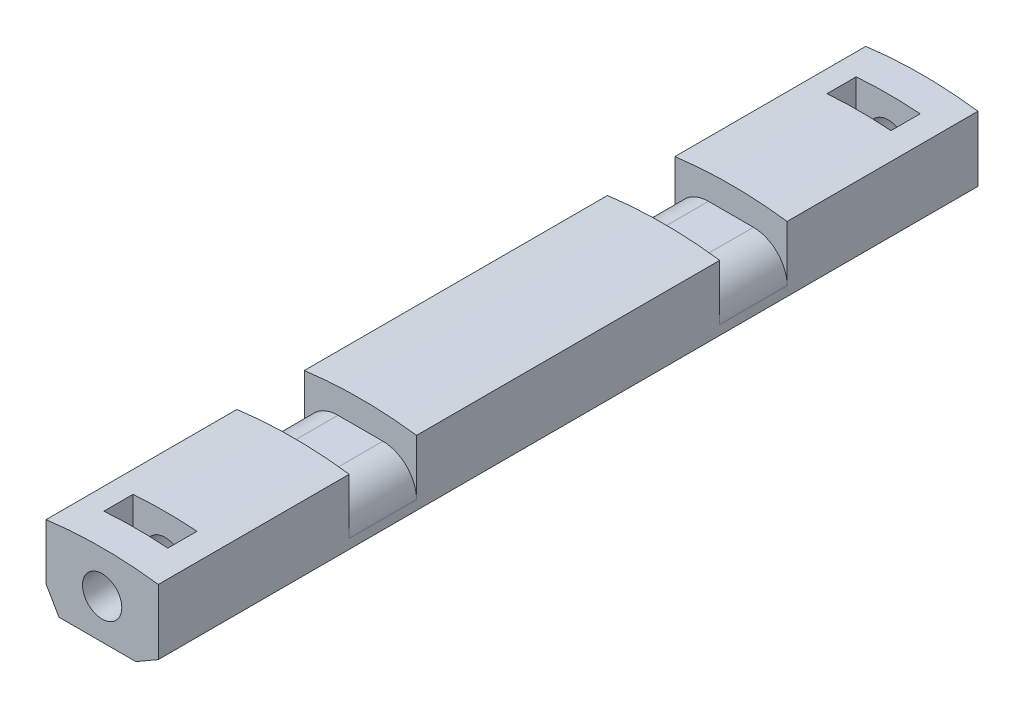
ISO-10303-21;
HEADER;
FILE_DESCRIPTION(('STEP AP214'),'2;1');
FILE_NAME('part.step','',(''),(''),'','','');
FILE_SCHEMA(('AUTOMOTIVE_DESIGN { 1 0 10303 214 1 1 1 1 }'));
ENDSEC;
DATA;
#1=APPLICATION_CONTEXT('core data for automotive mechanical design processes');
#2=APPLICATION_PROTOCOL_DEFINITION('international standard','automotive_design',2000,#1);
#3=PRODUCT_CONTEXT('',#1,'mechanical');
#4=PRODUCT('Part','Part','',(#3));
#5=PRODUCT_RELATED_PRODUCT_CATEGORY('part','',(#4));
#6=PRODUCT_DEFINITION_FORMATION('','',#4);
#7=PRODUCT_DEFINITION_CONTEXT('part definition',#1,'design');
#8=PRODUCT_DEFINITION('design','',#6,#7);
#9=PRODUCT_DEFINITION_SHAPE('','',#8);
#10=(LENGTH_UNIT() NAMED_UNIT(*) SI_UNIT(.MILLI.,.METRE.));
#11=(NAMED_UNIT(*) PLANE_ANGLE_UNIT() SI_UNIT($,.RADIAN.));
#12=(NAMED_UNIT(*) SI_UNIT($,.STERADIAN.) SOLID_ANGLE_UNIT());
#13=UNCERTAINTY_MEASURE_WITH_UNIT(LENGTH_MEASURE(1.E-05),#10,'distance_accuracy_value','');
#14=(GEOMETRIC_REPRESENTATION_CONTEXT(3) GLOBAL_UNCERTAINTY_ASSIGNED_CONTEXT((#13)) GLOBAL_UNIT_ASSIGNED_CONTEXT((#10,
#11,#12)) REPRESENTATION_CONTEXT('',''));
#15=CARTESIAN_POINT('',(0.,0.,0.));
#16=DIRECTION('',(0.,0.,1.));
#17=DIRECTION('',(1.,0.,0.));
#18=AXIS2_PLACEMENT_3D('',#15,#16,#17);
#19=CARTESIAN_POINT('',(-5.,0.,73.));
#20=DIRECTION('',(-1.,0.,0.));
#21=DIRECTION('',(0.,0.,1.));
#22=AXIS2_PLACEMENT_3D('',#19,#20,#21);
#23=PLANE('',#22);
#24=DIRECTION('',(0.,1.,0.));
#25=VECTOR('',#24,1.);
#26=CARTESIAN_POINT('',(-5.,0.,0.));
#27=LINE('',#26,#25);
#28=CARTESIAN_POINT('',(-5.,32.2140799131796,0.));
#29=VERTEX_POINT('',#28);
#30=CARTESIAN_POINT('',(-5.,37.1651718682963,0.));
#31=VERTEX_POINT('',#30);
#32=EDGE_CURVE('E371',#29,#31,#27,.T.);
#33=ORIENTED_EDGE('',*,*,#32,.F.);
#34=DIRECTION('',(0.,0.,1.));
#35=VECTOR('',#34,1.);
#36=CARTESIAN_POINT('',(-5.,32.2140799131796,73.));
#37=LINE('',#36,#35);
#38=CARTESIAN_POINT('',(-5.,32.2140799131795,17.));
#39=VERTEX_POINT('',#38);
#40=EDGE_CURVE('E11',#29,#39,#37,.T.);
#41=ORIENTED_EDGE('',*,*,#40,.T.);
#42=DIRECTION('',(0.,-1.,0.));
#43=VECTOR('',#42,1.);
#44=CARTESIAN_POINT('',(-5.,35.2140799131795,17.));
#45=LINE('',#44,#43);
#46=CARTESIAN_POINT('',(-5.,37.1651718682963,17.));
#47=VERTEX_POINT('',#46);
#48=EDGE_CURVE('E327',#47,#39,#45,.T.);
#49=ORIENTED_EDGE('',*,*,#48,.F.);
#50=DIRECTION('',(0.,0.,-1.));
#51=VECTOR('',#50,1.);
#52=CARTESIAN_POINT('',(-5.,37.1651718682963,73.));
#53=LINE('',#52,#51);
#54=EDGE_CURVE('E379',#47,#31,#53,.T.);
#55=ORIENTED_EDGE('',*,*,#54,.T.);
#56=EDGE_LOOP('',(#33,#41,#49,#55));
#57=FACE_BOUND('',#56,.T.);
#58=ADVANCED_FACE('F43',(#57),#23,.T.);
#59=DIRECTION('',(0.,1.,0.));
#60=VECTOR('',#59,1.);
#61=CARTESIAN_POINT('',(-5.,35.2140799131795,23.));
#62=LINE('',#61,#60);
#63=CARTESIAN_POINT('',(-5.,32.2140799131795,23.));
#64=VERTEX_POINT('',#63);
#65=CARTESIAN_POINT('',(-5.,37.1651718682963,23.));
#66=VERTEX_POINT('',#65);
#67=EDGE_CURVE('E326',#64,#66,#62,.T.);
#68=ORIENTED_EDGE('',*,*,#67,.F.);
#69=DIRECTION('',(0.,0.,1.));
#70=VECTOR('',#69,1.);
#71=CARTESIAN_POINT('',(-5.,32.2140799131796,73.));
#72=LINE('',#71,#70);
#73=CARTESIAN_POINT('',(-5.,32.2140799131795,50.));
#74=VERTEX_POINT('',#73);
#75=EDGE_CURVE('E52',#64,#74,#72,.T.);
#76=ORIENTED_EDGE('',*,*,#75,.T.);
#77=DIRECTION('',(0.,-1.,0.));
#78=VECTOR('',#77,1.);
#79=CARTESIAN_POINT('',(-5.,35.2140799131795,50.));
#80=LINE('',#79,#78);
#81=CARTESIAN_POINT('',(-5.,37.1651718682963,50.));
#82=VERTEX_POINT('',#81);
#83=EDGE_CURVE('E330',#82,#74,#80,.T.);
#84=ORIENTED_EDGE('',*,*,#83,.F.);
#85=EDGE_CURVE('E385',#82,#66,#53,.T.);
#86=ORIENTED_EDGE('',*,*,#85,.T.);
#87=EDGE_LOOP('',(#68,#76,#84,#86));
#88=FACE_BOUND('',#87,.T.);
#89=ADVANCED_FACE('F459',(#88),#23,.T.);
#90=CARTESIAN_POINT('',(0.,0.,73.));
#91=DIRECTION('',(0.,0.,-1.));
#92=DIRECTION('',(-1.,0.,0.));
#93=AXIS2_PLACEMENT_3D('',#90,#91,#92);
#94=CYLINDRICAL_SURFACE('',#93,37.5);
#95=CARTESIAN_POINT('',(0.,0.,56.));
#96=DIRECTION('',(0.,0.,1.));
#97=DIRECTION('',(1.,0.,0.));
#98=AXIS2_PLACEMENT_3D('',#95,#96,#97);
#99=CIRCLE('',#98,37.5);
#100=CARTESIAN_POINT('',(-5.,37.1651718682963,56.));
#101=VERTEX_POINT('',#100);
#102=CARTESIAN_POINT('',(5.,37.1651718682963,56.));
#103=VERTEX_POINT('',#102);
#104=EDGE_CURVE('E335',#101,#103,#99,.F.);
#105=ORIENTED_EDGE('',*,*,#104,.F.);
#106=CARTESIAN_POINT('',(-5.,37.1651718682963,73.));
#107=VERTEX_POINT('',#106);
#108=EDGE_CURVE('E381',#107,#101,#53,.T.);
#109=ORIENTED_EDGE('',*,*,#108,.F.);
#110=CARTESIAN_POINT('',(0.,0.,73.));
#111=DIRECTION('',(0.,0.,1.));
#112=DIRECTION('',(1.,0.,0.));
#113=AXIS2_PLACEMENT_3D('',#110,#111,#112);
#114=CIRCLE('',#113,37.5);
#115=CARTESIAN_POINT('',(5.,37.1651718682963,73.));
#116=VERTEX_POINT('',#115);
#117=EDGE_CURVE('E358',#107,#116,#114,.F.);
#118=ORIENTED_EDGE('',*,*,#117,.T.);
#119=DIRECTION('',(0.,0.,-1.));
#120=VECTOR('',#119,1.);
#121=CARTESIAN_POINT('',(5.,37.1651718682963,73.));
#122=LINE('',#121,#120);
#123=EDGE_CURVE('E376',#116,#103,#122,.T.);
#124=ORIENTED_EDGE('',*,*,#123,.T.);
#125=EDGE_LOOP('',(#105,#109,#118,#124));
#126=FACE_BOUND('',#125,.T.);
#127=DIRECTION('',(0.,0.,1.));
#128=VECTOR('',#127,1.);
#129=CARTESIAN_POINT('',(-2.85,37.3915431615225,67.4));
#130=LINE('',#129,#128);
#131=CARTESIAN_POINT('',(-2.85,37.3915431615225,67.4));
#132=VERTEX_POINT('',#131);
#133=CARTESIAN_POINT('',(-2.85,37.3915431615225,70.));
#134=VERTEX_POINT('',#133);
#135=EDGE_CURVE('E235',#132,#134,#130,.T.);
#136=ORIENTED_EDGE('',*,*,#135,.F.);
#137=CARTESIAN_POINT('',(0.,0.,67.4));
#138=DIRECTION('',(0.,0.,1.));
#139=DIRECTION('',(1.,0.,0.));
#140=AXIS2_PLACEMENT_3D('',#137,#138,#139);
#141=CIRCLE('',#140,37.5);
#142=CARTESIAN_POINT('',(2.85,37.3915431615225,67.4));
#143=VERTEX_POINT('',#142);
#144=EDGE_CURVE('E242',#143,#132,#141,.T.);
#145=ORIENTED_EDGE('',*,*,#144,.F.);
#146=DIRECTION('',(0.,0.,1.));
#147=VECTOR('',#146,1.);
#148=CARTESIAN_POINT('',(2.85,37.3915431615225,67.4));
#149=LINE('',#148,#147);
#150=CARTESIAN_POINT('',(2.85,37.3915431615225,70.));
#151=VERTEX_POINT('',#150);
#152=EDGE_CURVE('E439',#143,#151,#149,.T.);
#153=ORIENTED_EDGE('',*,*,#152,.T.);
#154=CARTESIAN_POINT('',(0.,0.,70.));
#155=DIRECTION('',(0.,0.,1.));
#156=DIRECTION('',(1.,0.,0.));
#157=AXIS2_PLACEMENT_3D('',#154,#155,#156);
#158=CIRCLE('',#157,37.5);
#159=EDGE_CURVE('E256',#151,#134,#158,.T.);
#160=ORIENTED_EDGE('',*,*,#159,.T.);
#161=EDGE_LOOP('',(#136,#145,#153,#160));
#162=FACE_BOUND('',#161,.T.);
#163=ADVANCED_FACE('F255',(#126,#162),#94,.T.);
#164=CARTESIAN_POINT('',(0.,0.,17.));
#165=DIRECTION('',(0.,0.,-1.));
#166=DIRECTION('',(-1.,0.,0.));
#167=AXIS2_PLACEMENT_3D('',#164,#165,#166);
#168=CIRCLE('',#167,37.5);
#169=CARTESIAN_POINT('',(5.,37.1651718682963,17.));
#170=VERTEX_POINT('',#169);
#171=EDGE_CURVE('E355',#170,#47,#168,.F.);
#172=ORIENTED_EDGE('',*,*,#171,.F.);
#173=CARTESIAN_POINT('',(5.,37.1651718682963,0.));
#174=VERTEX_POINT('',#173);
#175=EDGE_CURVE('E368',#170,#174,#122,.T.);
#176=ORIENTED_EDGE('',*,*,#175,.T.);
#177=CARTESIAN_POINT('',(0.,0.,0.));
#178=DIRECTION('',(0.,0.,1.));
#179=DIRECTION('',(1.,0.,0.));
#180=AXIS2_PLACEMENT_3D('',#177,#178,#179);
#181=CIRCLE('',#180,37.5);
#182=EDGE_CURVE('E357',#31,#174,#181,.F.);
#183=ORIENTED_EDGE('',*,*,#182,.F.);
#184=ORIENTED_EDGE('',*,*,#54,.F.);
#185=EDGE_LOOP('',(#172,#176,#183,#184));
#186=FACE_BOUND('',#185,.T.);
#187=DIRECTION('',(0.,0.,-1.));
#188=VECTOR('',#187,1.);
#189=CARTESIAN_POINT('',(2.85,37.3915431615225,5.6));
#190=LINE('',#189,#188);
#191=CARTESIAN_POINT('',(2.85,37.3915431615225,5.6));
#192=VERTEX_POINT('',#191);
#193=CARTESIAN_POINT('',(2.85,37.3915431615225,3.));
#194=VERTEX_POINT('',#193);
#195=EDGE_CURVE('E280',#192,#194,#190,.T.);
#196=ORIENTED_EDGE('',*,*,#195,.F.);
#197=CARTESIAN_POINT('',(0.,0.,5.6));
#198=DIRECTION('',(0.,0.,-1.));
#199=DIRECTION('',(-1.,0.,0.));
#200=AXIS2_PLACEMENT_3D('',#197,#198,#199);
#201=CIRCLE('',#200,37.5);
#202=CARTESIAN_POINT('',(-2.85,37.3915431615225,5.6));
#203=VERTEX_POINT('',#202);
#204=EDGE_CURVE('E264',#203,#192,#201,.T.);
#205=ORIENTED_EDGE('',*,*,#204,.F.);
#206=DIRECTION('',(0.,0.,-1.));
#207=VECTOR('',#206,1.);
#208=CARTESIAN_POINT('',(-2.85,37.3915431615225,5.6));
#209=LINE('',#208,#207);
#210=CARTESIAN_POINT('',(-2.85,37.3915431615225,3.));
#211=VERTEX_POINT('',#210);
#212=EDGE_CURVE('E296',#203,#211,#209,.T.);
#213=ORIENTED_EDGE('',*,*,#212,.T.);
#214=CARTESIAN_POINT('',(0.,0.,3.));
#215=DIRECTION('',(0.,0.,-1.));
#216=DIRECTION('',(-1.,0.,0.));
#217=AXIS2_PLACEMENT_3D('',#214,#215,#216);
#218=CIRCLE('',#217,37.5);
#219=EDGE_CURVE('E281',#211,#194,#218,.T.);
#220=ORIENTED_EDGE('',*,*,#219,.T.);
#221=EDGE_LOOP('',(#196,#205,#213,#220));
#222=FACE_BOUND('',#221,.T.);
#223=ADVANCED_FACE('F521',(#186,#222),#94,.T.);
#224=CARTESIAN_POINT('',(0.,0.,23.));
#225=DIRECTION('',(0.,0.,1.));
#226=DIRECTION('',(1.,0.,0.));
#227=AXIS2_PLACEMENT_3D('',#224,#225,#226);
#228=CIRCLE('',#227,37.5);
#229=CARTESIAN_POINT('',(5.,37.1651718682963,23.));
#230=VERTEX_POINT('',#229);
#231=EDGE_CURVE('E353',#66,#230,#228,.F.);
#232=ORIENTED_EDGE('',*,*,#231,.F.);
#233=ORIENTED_EDGE('',*,*,#85,.F.);
#234=CARTESIAN_POINT('',(0.,0.,50.));
#235=DIRECTION('',(0.,0.,-1.));
#236=DIRECTION('',(-1.,0.,0.));
#237=AXIS2_PLACEMENT_3D('',#234,#235,#236);
#238=CIRCLE('',#237,37.5);
#239=CARTESIAN_POINT('',(5.,37.1651718682963,50.));
#240=VERTEX_POINT('',#239);
#241=EDGE_CURVE('E351',#240,#82,#238,.F.);
#242=ORIENTED_EDGE('',*,*,#241,.F.);
#243=EDGE_CURVE('E380',#240,#230,#122,.T.);
#244=ORIENTED_EDGE('',*,*,#243,.T.);
#245=EDGE_LOOP('',(#232,#233,#242,#244));
#246=FACE_BOUND('',#245,.T.);
#247=ADVANCED_FACE('F512',(#246),#94,.T.);
#248=DIRECTION('',(0.,1.,0.));
#249=VECTOR('',#248,1.);
#250=CARTESIAN_POINT('',(-5.,35.2140799131795,56.));
#251=LINE('',#250,#249);
#252=CARTESIAN_POINT('',(-5.,32.2140799131795,56.));
#253=VERTEX_POINT('',#252);
#254=EDGE_CURVE('E344',#253,#101,#251,.T.);
#255=ORIENTED_EDGE('',*,*,#254,.F.);
#256=DIRECTION('',(0.,0.,1.));
#257=VECTOR('',#256,1.);
#258=CARTESIAN_POINT('',(-5.,32.2140799131796,73.));
#259=LINE('',#258,#257);
#260=CARTESIAN_POINT('',(-5.,32.2140799131796,73.));
#261=VERTEX_POINT('',#260);
#262=EDGE_CURVE('E59',#253,#261,#259,.T.);
#263=ORIENTED_EDGE('',*,*,#262,.T.);
#264=DIRECTION('',(0.,1.,0.));
#265=VECTOR('',#264,1.);
#266=CARTESIAN_POINT('',(-5.,0.,73.));
#267=LINE('',#266,#265);
#268=EDGE_CURVE('E361',#261,#107,#267,.T.);
#269=ORIENTED_EDGE('',*,*,#268,.T.);
#270=ORIENTED_EDGE('',*,*,#108,.T.);
#271=EDGE_LOOP('',(#255,#263,#269,#270));
#272=FACE_BOUND('',#271,.T.);
#273=ADVANCED_FACE('F496',(#272),#23,.T.);
#274=CARTESIAN_POINT('',(0.,30.2140799131795,73.));
#275=DIRECTION('',(0.,1.,0.));
#276=DIRECTION('',(0.,0.,1.));
#277=AXIS2_PLACEMENT_3D('',#274,#275,#276);
#278=PLANE('',#277);
#279=DIRECTION('',(1.,0.,0.));
#280=VECTOR('',#279,1.);
#281=CARTESIAN_POINT('',(0.,30.2140799131795,0.));
#282=LINE('',#281,#280);
#283=CARTESIAN_POINT('',(-3.84529946162075,30.2140799131795,0.));
#284=VERTEX_POINT('',#283);
#285=CARTESIAN_POINT('',(3.,30.2140799131795,0.));
#286=VERTEX_POINT('',#285);
#287=EDGE_CURVE('E373',#284,#286,#282,.T.);
#288=ORIENTED_EDGE('',*,*,#287,.T.);
#289=DIRECTION('',(0.,0.,1.));
#290=VECTOR('',#289,1.);
#291=CARTESIAN_POINT('',(3.,30.2140799131795,73.));
#292=LINE('',#291,#290);
#293=CARTESIAN_POINT('',(3.,30.2140799131795,73.));
#294=VERTEX_POINT('',#293);
#295=EDGE_CURVE('E67',#286,#294,#292,.T.);
#296=ORIENTED_EDGE('',*,*,#295,.T.);
#297=DIRECTION('',(1.,0.,0.));
#298=VECTOR('',#297,1.);
#299=CARTESIAN_POINT('',(0.,30.2140799131795,73.));
#300=LINE('',#299,#298);
#301=CARTESIAN_POINT('',(-3.84529946162075,30.2140799131795,73.));
#302=VERTEX_POINT('',#301);
#303=EDGE_CURVE('E364',#302,#294,#300,.T.);
#304=ORIENTED_EDGE('',*,*,#303,.F.);
#305=DIRECTION('',(0.,0.,-1.));
#306=VECTOR('',#305,1.);
#307=CARTESIAN_POINT('',(-3.84529946162075,30.2140799131795,0.));
#308=LINE('',#307,#306);
#309=EDGE_CURVE('E448',#302,#284,#308,.T.);
#310=ORIENTED_EDGE('',*,*,#309,.T.);
#311=EDGE_LOOP('',(#288,#296,#304,#310));
#312=FACE_BOUND('',#311,.T.);
#313=ADVANCED_FACE('F478',(#312),#278,.F.);
#314=CARTESIAN_POINT('',(5.,0.,73.));
#315=DIRECTION('',(-1.,0.,0.));
#316=DIRECTION('',(0.,0.,1.));
#317=AXIS2_PLACEMENT_3D('',#314,#315,#316);
#318=PLANE('',#317);
#319=DIRECTION('',(0.,1.,0.));
#320=VECTOR('',#319,1.);
#321=CARTESIAN_POINT('',(5.,0.,73.));
#322=LINE('',#321,#320);
#323=CARTESIAN_POINT('',(5.,31.3687804515588,73.));
#324=VERTEX_POINT('',#323);
#325=EDGE_CURVE('E366',#324,#116,#322,.T.);
#326=ORIENTED_EDGE('',*,*,#325,.F.);
#327=DIRECTION('',(0.,0.,-1.));
#328=VECTOR('',#327,1.);
#329=CARTESIAN_POINT('',(5.,31.3687804515588,73.));
#330=LINE('',#329,#328);
#331=CARTESIAN_POINT('',(5.,31.3687804515588,0.));
#332=VERTEX_POINT('',#331);
#333=EDGE_CURVE('E431',#324,#332,#330,.T.);
#334=ORIENTED_EDGE('',*,*,#333,.T.);
#335=DIRECTION('',(0.,1.,0.));
#336=VECTOR('',#335,1.);
#337=CARTESIAN_POINT('',(5.,0.,0.));
#338=LINE('',#337,#336);
#339=EDGE_CURVE('E362',#332,#174,#338,.T.);
#340=ORIENTED_EDGE('',*,*,#339,.T.);
#341=ORIENTED_EDGE('',*,*,#175,.F.);
#342=DIRECTION('',(0.,-1.,0.));
#343=VECTOR('',#342,1.);
#344=CARTESIAN_POINT('',(5.,0.,17.));
#345=LINE('',#344,#343);
#346=CARTESIAN_POINT('',(5.,32.2140799131795,17.));
#347=VERTEX_POINT('',#346);
#348=EDGE_CURVE('E387',#170,#347,#345,.T.);
#349=ORIENTED_EDGE('',*,*,#348,.T.);
#350=DIRECTION('',(0.,0.,1.));
#351=VECTOR('',#350,1.);
#352=CARTESIAN_POINT('',(5.,32.2140799131795,73.));
#353=LINE('',#352,#351);
#354=CARTESIAN_POINT('',(5.,32.2140799131795,23.));
#355=VERTEX_POINT('',#354);
#356=EDGE_CURVE('E389',#347,#355,#353,.T.);
#357=ORIENTED_EDGE('',*,*,#356,.T.);
#358=DIRECTION('',(0.,1.,0.));
#359=VECTOR('',#358,1.);
#360=CARTESIAN_POINT('',(5.,35.2140799131795,23.));
#361=LINE('',#360,#359);
#362=EDGE_CURVE('E322',#355,#230,#361,.T.);
#363=ORIENTED_EDGE('',*,*,#362,.T.);
#364=ORIENTED_EDGE('',*,*,#243,.F.);
#365=DIRECTION('',(0.,-1.,0.));
#366=VECTOR('',#365,1.);
#367=CARTESIAN_POINT('',(5.,0.,50.));
#368=LINE('',#367,#366);
#369=CARTESIAN_POINT('',(5.,32.2140799131795,50.));
#370=VERTEX_POINT('',#369);
#371=EDGE_CURVE('E384',#240,#370,#368,.T.);
#372=ORIENTED_EDGE('',*,*,#371,.T.);
#373=DIRECTION('',(0.,0.,1.));
#374=VECTOR('',#373,1.);
#375=CARTESIAN_POINT('',(5.,32.2140799131795,73.));
#376=LINE('',#375,#374);
#377=CARTESIAN_POINT('',(5.,32.2140799131795,56.));
#378=VERTEX_POINT('',#377);
#379=EDGE_CURVE('E392',#370,#378,#376,.T.);
#380=ORIENTED_EDGE('',*,*,#379,.T.);
#381=DIRECTION('',(0.,1.,0.));
#382=VECTOR('',#381,1.);
#383=CARTESIAN_POINT('',(5.,35.2140799131795,56.));
#384=LINE('',#383,#382);
#385=EDGE_CURVE('E341',#378,#103,#384,.T.);
#386=ORIENTED_EDGE('',*,*,#385,.T.);
#387=ORIENTED_EDGE('',*,*,#123,.F.);
#388=EDGE_LOOP('',(#326,#334,#340,#341,#349,#357,#363,#364,#372,#380,#386,#387));
#389=FACE_BOUND('',#388,.T.);
#390=ADVANCED_FACE('F489',(#389),#318,.F.);
#391=CARTESIAN_POINT('',(0.,0.,73.));
#392=DIRECTION('',(0.,0.,1.));
#393=DIRECTION('',(1.,0.,0.));
#394=AXIS2_PLACEMENT_3D('',#391,#392,#393);
#395=PLANE('',#394);
#396=CARTESIAN_POINT('',(0.,33.75,73.));
#397=DIRECTION('',(0.,0.,1.));
#398=DIRECTION('',(1.,0.,0.));
#399=AXIS2_PLACEMENT_3D('',#396,#397,#398);
#400=CIRCLE('',#399,1.75);
#401=CARTESIAN_POINT('',(1.75,33.75,73.));
#402=VERTEX_POINT('',#401);
#403=EDGE_CURVE('E311',#402,#402,#400,.T.);
#404=ORIENTED_EDGE('',*,*,#403,.F.);
#405=EDGE_LOOP('',(#404));
#406=FACE_BOUND('',#405,.T.);
#407=ORIENTED_EDGE('',*,*,#303,.T.);
#408=DIRECTION('',(-0.866025403784441,-0.499999999999997,0.));
#409=VECTOR('',#408,1.);
#410=CARTESIAN_POINT('',(-12.3330803783933,21.3615218292081,73.));
#411=LINE('',#410,#409);
#412=EDGE_CURVE('E454',#294,#324,#411,.F.);
#413=ORIENTED_EDGE('',*,*,#412,.T.);
#414=ORIENTED_EDGE('',*,*,#325,.T.);
#415=ORIENTED_EDGE('',*,*,#117,.F.);
#416=ORIENTED_EDGE('',*,*,#268,.F.);
#417=DIRECTION('',(0.499999999999997,-0.86602540378444,0.));
#418=VECTOR('',#417,1.);
#419=CARTESIAN_POINT('',(10.1991057821777,5.88845646883371,73.));
#420=LINE('',#419,#418);
#421=EDGE_CURVE('E452',#261,#302,#420,.T.);
#422=ORIENTED_EDGE('',*,*,#421,.T.);
#423=EDGE_LOOP('',(#407,#413,#414,#415,#416,#422));
#424=FACE_BOUND('',#423,.T.);
#425=ADVANCED_FACE('F475',(#406,#424),#395,.T.);
#426=CARTESIAN_POINT('',(0.,0.,0.));
#427=DIRECTION('',(0.,0.,1.));
#428=DIRECTION('',(1.,0.,0.));
#429=AXIS2_PLACEMENT_3D('',#426,#427,#428);
#430=PLANE('',#429);
#431=CARTESIAN_POINT('',(0.,33.75,0.));
#432=DIRECTION('',(0.,0.,-1.));
#433=DIRECTION('',(-1.,0.,0.));
#434=AXIS2_PLACEMENT_3D('',#431,#432,#433);
#435=CIRCLE('',#434,1.75);
#436=CARTESIAN_POINT('',(-1.75,33.75,0.));
#437=VERTEX_POINT('',#436);
#438=EDGE_CURVE('E312',#437,#437,#435,.T.);
#439=ORIENTED_EDGE('',*,*,#438,.F.);
#440=EDGE_LOOP('',(#439));
#441=FACE_BOUND('',#440,.T.);
#442=ORIENTED_EDGE('',*,*,#339,.F.);
#443=DIRECTION('',(0.866025403784441,0.499999999999997,0.));
#444=VECTOR('',#443,1.);
#445=CARTESIAN_POINT('',(5.,31.3687804515588,0.));
#446=LINE('',#445,#444);
#447=EDGE_CURVE('E446',#332,#286,#446,.F.);
#448=ORIENTED_EDGE('',*,*,#447,.T.);
#449=ORIENTED_EDGE('',*,*,#287,.F.);
#450=DIRECTION('',(-0.499999999999997,0.86602540378444,0.));
#451=VECTOR('',#450,1.);
#452=CARTESIAN_POINT('',(-3.84529946162075,30.2140799131795,0.));
#453=LINE('',#452,#451);
#454=EDGE_CURVE('E444',#284,#29,#453,.T.);
#455=ORIENTED_EDGE('',*,*,#454,.T.);
#456=ORIENTED_EDGE('',*,*,#32,.T.);
#457=ORIENTED_EDGE('',*,*,#182,.T.);
#458=EDGE_LOOP('',(#442,#448,#449,#455,#456,#457));
#459=FACE_BOUND('',#458,.T.);
#460=ADVANCED_FACE('F482',(#441,#459),#430,.F.);
#461=CARTESIAN_POINT('',(5.,35.2140799131795,50.));
#462=DIRECTION('',(0.,0.,-1.));
#463=DIRECTION('',(-1.,0.,0.));
#464=AXIS2_PLACEMENT_3D('',#461,#462,#463);
#465=PLANE('',#464);
#466=ORIENTED_EDGE('',*,*,#241,.T.);
#467=ORIENTED_EDGE('',*,*,#83,.T.);
#468=CARTESIAN_POINT('',(-2.,32.2140799131795,50.));
#469=DIRECTION('',(0.,0.,-1.));
#470=DIRECTION('',(-1.,0.,0.));
#471=AXIS2_PLACEMENT_3D('',#468,#469,#470);
#472=CIRCLE('',#471,3.);
#473=CARTESIAN_POINT('',(-2.,35.2140799131795,50.));
#474=VERTEX_POINT('',#473);
#475=EDGE_CURVE('E419',#74,#474,#472,.T.);
#476=ORIENTED_EDGE('',*,*,#475,.T.);
#477=DIRECTION('',(-1.,0.,0.));
#478=VECTOR('',#477,1.);
#479=CARTESIAN_POINT('',(5.,35.2140799131795,50.));
#480=LINE('',#479,#478);
#481=CARTESIAN_POINT('',(2.,35.2140799131795,50.));
#482=VERTEX_POINT('',#481);
#483=EDGE_CURVE('E338',#482,#474,#480,.T.);
#484=ORIENTED_EDGE('',*,*,#483,.F.);
#485=CARTESIAN_POINT('',(2.,32.2140799131795,50.));
#486=DIRECTION('',(0.,0.,-1.));
#487=DIRECTION('',(-1.,0.,0.));
#488=AXIS2_PLACEMENT_3D('',#485,#486,#487);
#489=CIRCLE('',#488,3.);
#490=EDGE_CURVE('E413',#482,#370,#489,.T.);
#491=ORIENTED_EDGE('',*,*,#490,.T.);
#492=ORIENTED_EDGE('',*,*,#371,.F.);
#493=EDGE_LOOP('',(#466,#467,#476,#484,#491,#492));
#494=FACE_BOUND('',#493,.T.);
#495=ADVANCED_FACE('F465',(#494),#465,.F.);
#496=CARTESIAN_POINT('',(5.,35.2140799131795,56.));
#497=DIRECTION('',(0.,0.,1.));
#498=DIRECTION('',(1.,0.,0.));
#499=AXIS2_PLACEMENT_3D('',#496,#497,#498);
#500=PLANE('',#499);
#501=ORIENTED_EDGE('',*,*,#104,.T.);
#502=ORIENTED_EDGE('',*,*,#385,.F.);
#503=CARTESIAN_POINT('',(2.,32.2140799131795,56.));
#504=DIRECTION('',(0.,0.,1.));
#505=DIRECTION('',(1.,0.,0.));
#506=AXIS2_PLACEMENT_3D('',#503,#504,#505);
#507=CIRCLE('',#506,3.);
#508=CARTESIAN_POINT('',(2.,35.2140799131795,56.));
#509=VERTEX_POINT('',#508);
#510=EDGE_CURVE('E411',#378,#509,#507,.T.);
#511=ORIENTED_EDGE('',*,*,#510,.T.);
#512=DIRECTION('',(-1.,0.,0.));
#513=VECTOR('',#512,1.);
#514=CARTESIAN_POINT('',(5.,35.2140799131795,56.));
#515=LINE('',#514,#513);
#516=CARTESIAN_POINT('',(-2.,35.2140799131795,56.));
#517=VERTEX_POINT('',#516);
#518=EDGE_CURVE('E319',#509,#517,#515,.T.);
#519=ORIENTED_EDGE('',*,*,#518,.T.);
#520=CARTESIAN_POINT('',(-2.,32.2140799131795,56.));
#521=DIRECTION('',(0.,0.,1.));
#522=DIRECTION('',(1.,0.,0.));
#523=AXIS2_PLACEMENT_3D('',#520,#521,#522);
#524=CIRCLE('',#523,3.);
#525=EDGE_CURVE('E416',#517,#253,#524,.T.);
#526=ORIENTED_EDGE('',*,*,#525,.T.);
#527=ORIENTED_EDGE('',*,*,#254,.T.);
#528=EDGE_LOOP('',(#501,#502,#511,#519,#526,#527));
#529=FACE_BOUND('',#528,.T.);
#530=ADVANCED_FACE('F498',(#529),#500,.F.);
#531=CARTESIAN_POINT('',(5.,35.2140799131795,50.));
#532=DIRECTION('',(0.,-1.,0.));
#533=DIRECTION('',(1.,0.,0.));
#534=AXIS2_PLACEMENT_3D('',#531,#532,#533);
#535=PLANE('',#534);
#536=ORIENTED_EDGE('',*,*,#518,.F.);
#537=DIRECTION('',(0.,0.,1.));
#538=VECTOR('',#537,1.);
#539=CARTESIAN_POINT('',(2.,35.2140799131795,50.));
#540=LINE('',#539,#538);
#541=EDGE_CURVE('E398',#509,#482,#540,.F.);
#542=ORIENTED_EDGE('',*,*,#541,.T.);
#543=ORIENTED_EDGE('',*,*,#483,.T.);
#544=DIRECTION('',(0.,0.,1.));
#545=VECTOR('',#544,1.);
#546=CARTESIAN_POINT('',(-2.,35.2140799131795,56.));
#547=LINE('',#546,#545);
#548=EDGE_CURVE('E395',#474,#517,#547,.T.);
#549=ORIENTED_EDGE('',*,*,#548,.T.);
#550=EDGE_LOOP('',(#536,#542,#543,#549));
#551=FACE_BOUND('',#550,.T.);
#552=ADVANCED_FACE('F501',(#551),#535,.F.);
#553=CARTESIAN_POINT('',(5.,35.2140799131795,17.));
#554=DIRECTION('',(0.,0.,-1.));
#555=DIRECTION('',(-1.,0.,0.));
#556=AXIS2_PLACEMENT_3D('',#553,#554,#555);
#557=PLANE('',#556);
#558=ORIENTED_EDGE('',*,*,#171,.T.);
#559=ORIENTED_EDGE('',*,*,#48,.T.);
#560=CARTESIAN_POINT('',(-2.,32.2140799131795,17.));
#561=DIRECTION('',(0.,0.,-1.));
#562=DIRECTION('',(-1.,0.,0.));
#563=AXIS2_PLACEMENT_3D('',#560,#561,#562);
#564=CIRCLE('',#563,3.);
#565=CARTESIAN_POINT('',(-2.,35.2140799131795,17.));
#566=VERTEX_POINT('',#565);
#567=EDGE_CURVE('E429',#39,#566,#564,.T.);
#568=ORIENTED_EDGE('',*,*,#567,.T.);
#569=DIRECTION('',(-1.,0.,0.));
#570=VECTOR('',#569,1.);
#571=CARTESIAN_POINT('',(5.,35.2140799131795,17.));
#572=LINE('',#571,#570);
#573=CARTESIAN_POINT('',(2.,35.2140799131795,17.));
#574=VERTEX_POINT('',#573);
#575=EDGE_CURVE('E325',#574,#566,#572,.T.);
#576=ORIENTED_EDGE('',*,*,#575,.F.);
#577=CARTESIAN_POINT('',(2.,32.2140799131795,17.));
#578=DIRECTION('',(0.,0.,-1.));
#579=DIRECTION('',(-1.,0.,0.));
#580=AXIS2_PLACEMENT_3D('',#577,#578,#579);
#581=CIRCLE('',#580,3.);
#582=EDGE_CURVE('E423',#574,#347,#581,.T.);
#583=ORIENTED_EDGE('',*,*,#582,.T.);
#584=ORIENTED_EDGE('',*,*,#348,.F.);
#585=EDGE_LOOP('',(#558,#559,#568,#576,#583,#584));
#586=FACE_BOUND('',#585,.T.);
#587=ADVANCED_FACE('F527',(#586),#557,.F.);
#588=CARTESIAN_POINT('',(5.,35.2140799131795,23.));
#589=DIRECTION('',(0.,0.,1.));
#590=DIRECTION('',(1.,0.,0.));
#591=AXIS2_PLACEMENT_3D('',#588,#589,#590);
#592=PLANE('',#591);
#593=ORIENTED_EDGE('',*,*,#231,.T.);
#594=ORIENTED_EDGE('',*,*,#362,.F.);
#595=CARTESIAN_POINT('',(2.,32.2140799131795,23.));
#596=DIRECTION('',(0.,0.,1.));
#597=DIRECTION('',(1.,0.,0.));
#598=AXIS2_PLACEMENT_3D('',#595,#596,#597);
#599=CIRCLE('',#598,3.);
#600=CARTESIAN_POINT('',(2.,35.2140799131795,23.));
#601=VERTEX_POINT('',#600);
#602=EDGE_CURVE('E421',#355,#601,#599,.T.);
#603=ORIENTED_EDGE('',*,*,#602,.T.);
#604=DIRECTION('',(-1.,0.,0.));
#605=VECTOR('',#604,1.);
#606=CARTESIAN_POINT('',(5.,35.2140799131795,23.));
#607=LINE('',#606,#605);
#608=CARTESIAN_POINT('',(-2.,35.2140799131795,23.));
#609=VERTEX_POINT('',#608);
#610=EDGE_CURVE('E332',#601,#609,#607,.T.);
#611=ORIENTED_EDGE('',*,*,#610,.T.);
#612=CARTESIAN_POINT('',(-2.,32.2140799131795,23.));
#613=DIRECTION('',(0.,0.,1.));
#614=DIRECTION('',(1.,0.,0.));
#615=AXIS2_PLACEMENT_3D('',#612,#613,#614);
#616=CIRCLE('',#615,3.);
#617=EDGE_CURVE('E426',#609,#64,#616,.T.);
#618=ORIENTED_EDGE('',*,*,#617,.T.);
#619=ORIENTED_EDGE('',*,*,#67,.T.);
#620=EDGE_LOOP('',(#593,#594,#603,#611,#618,#619));
#621=FACE_BOUND('',#620,.T.);
#622=ADVANCED_FACE('F534',(#621),#592,.F.);
#623=CARTESIAN_POINT('',(5.,35.2140799131795,17.));
#624=DIRECTION('',(0.,-1.,0.));
#625=DIRECTION('',(1.,0.,0.));
#626=AXIS2_PLACEMENT_3D('',#623,#624,#625);
#627=PLANE('',#626);
#628=ORIENTED_EDGE('',*,*,#610,.F.);
#629=DIRECTION('',(0.,0.,1.));
#630=VECTOR('',#629,1.);
#631=CARTESIAN_POINT('',(2.,35.2140799131795,17.));
#632=LINE('',#631,#630);
#633=EDGE_CURVE('E409',#601,#574,#632,.F.);
#634=ORIENTED_EDGE('',*,*,#633,.T.);
#635=ORIENTED_EDGE('',*,*,#575,.T.);
#636=DIRECTION('',(0.,0.,1.));
#637=VECTOR('',#636,1.);
#638=CARTESIAN_POINT('',(-2.,35.2140799131795,23.));
#639=LINE('',#638,#637);
#640=EDGE_CURVE('E406',#566,#609,#639,.T.);
#641=ORIENTED_EDGE('',*,*,#640,.T.);
#642=EDGE_LOOP('',(#628,#634,#635,#641));
#643=FACE_BOUND('',#642,.T.);
#644=ADVANCED_FACE('F536',(#643),#627,.F.);
#645=CARTESIAN_POINT('',(0.,33.75,61.));
#646=DIRECTION('',(0.,0.,1.));
#647=DIRECTION('',(1.,0.,0.));
#648=AXIS2_PLACEMENT_3D('',#645,#646,#647);
#649=CYLINDRICAL_SURFACE('',#648,1.75);
#650=CARTESIAN_POINT('',(0.,33.75,70.));
#651=DIRECTION('',(0.,0.,1.));
#652=DIRECTION('',(1.,0.,0.));
#653=AXIS2_PLACEMENT_3D('',#650,#651,#652);
#654=CIRCLE('',#653,1.75);
#655=CARTESIAN_POINT('',(1.75,33.75,70.));
#656=VERTEX_POINT('',#655);
#657=EDGE_CURVE('E436',#656,#656,#654,.F.);
#658=ORIENTED_EDGE('',*,*,#657,.T.);
#659=EDGE_LOOP('',(#658));
#660=FACE_BOUND('',#659,.T.);
#661=ORIENTED_EDGE('',*,*,#403,.T.);
#662=EDGE_LOOP('',(#661));
#663=FACE_BOUND('',#662,.T.);
#664=ADVANCED_FACE('F586',(#660,#663),#649,.F.);
#665=CARTESIAN_POINT('',(0.,33.75,12.));
#666=DIRECTION('',(0.,0.,-1.));
#667=DIRECTION('',(-1.,0.,0.));
#668=AXIS2_PLACEMENT_3D('',#665,#666,#667);
#669=CYLINDRICAL_SURFACE('',#668,1.75);
#670=CARTESIAN_POINT('',(0.,33.75,3.));
#671=DIRECTION('',(0.,0.,-1.));
#672=DIRECTION('',(-1.,0.,0.));
#673=AXIS2_PLACEMENT_3D('',#670,#671,#672);
#674=CIRCLE('',#673,1.75);
#675=CARTESIAN_POINT('',(-1.75,33.75,3.));
#676=VERTEX_POINT('',#675);
#677=EDGE_CURVE('E299',#676,#676,#674,.F.);
#678=ORIENTED_EDGE('',*,*,#677,.T.);
#679=EDGE_LOOP('',(#678));
#680=FACE_BOUND('',#679,.T.);
#681=ORIENTED_EDGE('',*,*,#438,.T.);
#682=EDGE_LOOP('',(#681));
#683=FACE_BOUND('',#682,.T.);
#684=ADVANCED_FACE('F590',(#680,#683),#669,.F.);
#685=CARTESIAN_POINT('',(2.,32.2140799131795,73.));
#686=DIRECTION('',(0.,0.,1.));
#687=DIRECTION('',(1.,0.,0.));
#688=AXIS2_PLACEMENT_3D('',#685,#686,#687);
#689=CYLINDRICAL_SURFACE('',#688,3.);
#690=ORIENTED_EDGE('',*,*,#490,.F.);
#691=ORIENTED_EDGE('',*,*,#541,.F.);
#692=ORIENTED_EDGE('',*,*,#510,.F.);
#693=ORIENTED_EDGE('',*,*,#379,.F.);
#694=EDGE_LOOP('',(#690,#691,#692,#693));
#695=FACE_BOUND('',#694,.T.);
#696=ADVANCED_FACE('F506',(#695),#689,.T.);
#697=CARTESIAN_POINT('',(-2.,32.2140799131795,50.));
#698=DIRECTION('',(0.,0.,-1.));
#699=DIRECTION('',(-1.,0.,0.));
#700=AXIS2_PLACEMENT_3D('',#697,#698,#699);
#701=CYLINDRICAL_SURFACE('',#700,3.);
#702=ORIENTED_EDGE('',*,*,#475,.F.);
#703=DIRECTION('',(0.,0.,1.));
#704=VECTOR('',#703,1.);
#705=CARTESIAN_POINT('',(-5.,32.2140799131795,50.));
#706=LINE('',#705,#704);
#707=EDGE_CURVE('E403',#253,#74,#706,.F.);
#708=ORIENTED_EDGE('',*,*,#707,.F.);
#709=ORIENTED_EDGE('',*,*,#525,.F.);
#710=ORIENTED_EDGE('',*,*,#548,.F.);
#711=EDGE_LOOP('',(#702,#708,#709,#710));
#712=FACE_BOUND('',#711,.T.);
#713=ADVANCED_FACE('F471',(#712),#701,.T.);
#714=CARTESIAN_POINT('',(2.,32.2140799131795,73.));
#715=DIRECTION('',(0.,0.,1.));
#716=DIRECTION('',(1.,0.,0.));
#717=AXIS2_PLACEMENT_3D('',#714,#715,#716);
#718=CYLINDRICAL_SURFACE('',#717,3.);
#719=ORIENTED_EDGE('',*,*,#582,.F.);
#720=ORIENTED_EDGE('',*,*,#633,.F.);
#721=ORIENTED_EDGE('',*,*,#602,.F.);
#722=ORIENTED_EDGE('',*,*,#356,.F.);
#723=EDGE_LOOP('',(#719,#720,#721,#722));
#724=FACE_BOUND('',#723,.T.);
#725=ADVANCED_FACE('F531',(#724),#718,.T.);
#726=CARTESIAN_POINT('',(-2.,32.2140799131795,17.));
#727=DIRECTION('',(0.,0.,-1.));
#728=DIRECTION('',(-1.,0.,0.));
#729=AXIS2_PLACEMENT_3D('',#726,#727,#728);
#730=CYLINDRICAL_SURFACE('',#729,3.);
#731=ORIENTED_EDGE('',*,*,#567,.F.);
#732=DIRECTION('',(0.,0.,1.));
#733=VECTOR('',#732,1.);
#734=CARTESIAN_POINT('',(-5.,32.2140799131795,17.));
#735=LINE('',#734,#733);
#736=EDGE_CURVE('E400',#64,#39,#735,.F.);
#737=ORIENTED_EDGE('',*,*,#736,.F.);
#738=ORIENTED_EDGE('',*,*,#617,.F.);
#739=ORIENTED_EDGE('',*,*,#640,.F.);
#740=EDGE_LOOP('',(#731,#737,#738,#739));
#741=FACE_BOUND('',#740,.T.);
#742=ADVANCED_FACE('F540',(#741),#730,.T.);
#743=CARTESIAN_POINT('',(0.,0.,5.6));
#744=DIRECTION('',(0.,0.,-1.));
#745=DIRECTION('',(-1.,0.,0.));
#746=AXIS2_PLACEMENT_3D('',#743,#744,#745);
#747=PLANE('',#746);
#748=ORIENTED_EDGE('',*,*,#204,.T.);
#749=DIRECTION('',(0.,-1.,0.));
#750=VECTOR('',#749,1.);
#751=CARTESIAN_POINT('',(2.85,37.3915431615225,5.6));
#752=LINE('',#751,#750);
#753=CARTESIAN_POINT('',(2.85,31.9954482671904,5.6));
#754=VERTEX_POINT('',#753);
#755=EDGE_CURVE('E267',#192,#754,#752,.T.);
#756=ORIENTED_EDGE('',*,*,#755,.T.);
#757=DIRECTION('',(-0.866025403784438,-0.500000000000001,0.));
#758=VECTOR('',#757,1.);
#759=CARTESIAN_POINT('',(2.85,31.9954482671904,5.6));
#760=LINE('',#759,#758);
#761=CARTESIAN_POINT('',(0.,30.35,5.6));
#762=VERTEX_POINT('',#761);
#763=EDGE_CURVE('E271',#754,#762,#760,.T.);
#764=ORIENTED_EDGE('',*,*,#763,.T.);
#765=DIRECTION('',(-0.866025403784438,0.500000000000001,0.));
#766=VECTOR('',#765,1.);
#767=CARTESIAN_POINT('',(0.,30.35,5.6));
#768=LINE('',#767,#766);
#769=CARTESIAN_POINT('',(-2.85,31.9954482671904,5.6));
#770=VERTEX_POINT('',#769);
#771=EDGE_CURVE('E274',#762,#770,#768,.T.);
#772=ORIENTED_EDGE('',*,*,#771,.T.);
#773=DIRECTION('',(0.,1.,0.));
#774=VECTOR('',#773,1.);
#775=CARTESIAN_POINT('',(-2.85,31.9954482671904,5.6));
#776=LINE('',#775,#774);
#777=EDGE_CURVE('E277',#770,#203,#776,.T.);
#778=ORIENTED_EDGE('',*,*,#777,.T.);
#779=EDGE_LOOP('',(#748,#756,#764,#772,#778));
#780=FACE_BOUND('',#779,.T.);
#781=CARTESIAN_POINT('',(0.,33.75,5.6));
#782=DIRECTION('',(0.,0.,-1.));
#783=DIRECTION('',(-1.,0.,0.));
#784=AXIS2_PLACEMENT_3D('',#781,#782,#783);
#785=CIRCLE('',#784,1.75);
#786=CARTESIAN_POINT('',(-1.75,33.75,5.6));
#787=VERTEX_POINT('',#786);
#788=EDGE_CURVE('E315',#787,#787,#785,.F.);
#789=ORIENTED_EDGE('',*,*,#788,.T.);
#790=EDGE_LOOP('',(#789));
#791=FACE_BOUND('',#790,.T.);
#792=ADVANCED_FACE('F543',(#780,#791),#747,.T.);
#793=CARTESIAN_POINT('',(0.,0.,3.));
#794=DIRECTION('',(0.,0.,-1.));
#795=DIRECTION('',(-1.,0.,0.));
#796=AXIS2_PLACEMENT_3D('',#793,#794,#795);
#797=PLANE('',#796);
#798=ORIENTED_EDGE('',*,*,#219,.F.);
#799=DIRECTION('',(0.,1.,0.));
#800=VECTOR('',#799,1.);
#801=CARTESIAN_POINT('',(-2.85,31.9954482671904,3.));
#802=LINE('',#801,#800);
#803=CARTESIAN_POINT('',(-2.85,31.9954482671904,3.));
#804=VERTEX_POINT('',#803);
#805=EDGE_CURVE('E268',#804,#211,#802,.T.);
#806=ORIENTED_EDGE('',*,*,#805,.F.);
#807=DIRECTION('',(-0.866025403784438,0.500000000000001,0.));
#808=VECTOR('',#807,1.);
#809=CARTESIAN_POINT('',(0.,30.35,3.));
#810=LINE('',#809,#808);
#811=CARTESIAN_POINT('',(0.,30.35,3.));
#812=VERTEX_POINT('',#811);
#813=EDGE_CURVE('E291',#812,#804,#810,.T.);
#814=ORIENTED_EDGE('',*,*,#813,.F.);
#815=DIRECTION('',(-0.866025403784438,-0.500000000000001,0.));
#816=VECTOR('',#815,1.);
#817=CARTESIAN_POINT('',(2.85,31.9954482671904,3.));
#818=LINE('',#817,#816);
#819=CARTESIAN_POINT('',(2.85,31.9954482671904,3.));
#820=VERTEX_POINT('',#819);
#821=EDGE_CURVE('E288',#820,#812,#818,.T.);
#822=ORIENTED_EDGE('',*,*,#821,.F.);
#823=DIRECTION('',(0.,-1.,0.));
#824=VECTOR('',#823,1.);
#825=CARTESIAN_POINT('',(2.85,37.3915431615225,3.));
#826=LINE('',#825,#824);
#827=EDGE_CURVE('E284',#194,#820,#826,.T.);
#828=ORIENTED_EDGE('',*,*,#827,.F.);
#829=EDGE_LOOP('',(#798,#806,#814,#822,#828));
#830=FACE_BOUND('',#829,.T.);
#831=ORIENTED_EDGE('',*,*,#677,.F.);
#832=EDGE_LOOP('',(#831));
#833=FACE_BOUND('',#832,.T.);
#834=ADVANCED_FACE('F550',(#830,#833),#797,.F.);
#835=CARTESIAN_POINT('',(-2.85,31.9954482671904,5.6));
#836=DIRECTION('',(-1.,0.,0.));
#837=DIRECTION('',(0.,0.,1.));
#838=AXIS2_PLACEMENT_3D('',#835,#836,#837);
#839=PLANE('',#838);
#840=ORIENTED_EDGE('',*,*,#805,.T.);
#841=ORIENTED_EDGE('',*,*,#212,.F.);
#842=ORIENTED_EDGE('',*,*,#777,.F.);
#843=DIRECTION('',(0.,0.,-1.));
#844=VECTOR('',#843,1.);
#845=CARTESIAN_POINT('',(-2.85,31.9954482671904,5.6));
#846=LINE('',#845,#844);
#847=EDGE_CURVE('E300',#770,#804,#846,.T.);
#848=ORIENTED_EDGE('',*,*,#847,.T.);
#849=EDGE_LOOP('',(#840,#841,#842,#848));
#850=FACE_BOUND('',#849,.T.);
#851=ADVANCED_FACE('F684',(#850),#839,.F.);
#852=CARTESIAN_POINT('',(0.,30.35,5.6));
#853=DIRECTION('',(-0.500000000000001,-0.866025403784438,0.));
#854=DIRECTION('',(0.866025403784438,-0.500000000000001,0.));
#855=AXIS2_PLACEMENT_3D('',#852,#853,#854);
#856=PLANE('',#855);
#857=ORIENTED_EDGE('',*,*,#813,.T.);
#858=ORIENTED_EDGE('',*,*,#847,.F.);
#859=ORIENTED_EDGE('',*,*,#771,.F.);
#860=DIRECTION('',(0.,0.,-1.));
#861=VECTOR('',#860,1.);
#862=CARTESIAN_POINT('',(0.,30.35,5.6));
#863=LINE('',#862,#861);
#864=EDGE_CURVE('E302',#762,#812,#863,.T.);
#865=ORIENTED_EDGE('',*,*,#864,.T.);
#866=EDGE_LOOP('',(#857,#858,#859,#865));
#867=FACE_BOUND('',#866,.T.);
#868=ADVANCED_FACE('F674',(#867),#856,.F.);
#869=CARTESIAN_POINT('',(2.85,31.9954482671904,5.6));
#870=DIRECTION('',(0.500000000000001,-0.866025403784438,0.));
#871=DIRECTION('',(0.866025403784438,0.500000000000001,0.));
#872=AXIS2_PLACEMENT_3D('',#869,#870,#871);
#873=PLANE('',#872);
#874=ORIENTED_EDGE('',*,*,#821,.T.);
#875=ORIENTED_EDGE('',*,*,#864,.F.);
#876=ORIENTED_EDGE('',*,*,#763,.F.);
#877=DIRECTION('',(0.,0.,-1.));
#878=VECTOR('',#877,1.);
#879=CARTESIAN_POINT('',(2.85,31.9954482671904,5.6));
#880=LINE('',#879,#878);
#881=EDGE_CURVE('E304',#754,#820,#880,.T.);
#882=ORIENTED_EDGE('',*,*,#881,.T.);
#883=EDGE_LOOP('',(#874,#875,#876,#882));
#884=FACE_BOUND('',#883,.T.);
#885=ADVANCED_FACE('F664',(#884),#873,.F.);
#886=CARTESIAN_POINT('',(2.85,37.3915431615225,5.6));
#887=DIRECTION('',(1.,0.,0.));
#888=DIRECTION('',(0.,0.,-1.));
#889=AXIS2_PLACEMENT_3D('',#886,#887,#888);
#890=PLANE('',#889);
#891=ORIENTED_EDGE('',*,*,#827,.T.);
#892=ORIENTED_EDGE('',*,*,#881,.F.);
#893=ORIENTED_EDGE('',*,*,#755,.F.);
#894=ORIENTED_EDGE('',*,*,#195,.T.);
#895=EDGE_LOOP('',(#891,#892,#893,#894));
#896=FACE_BOUND('',#895,.T.);
#897=ADVANCED_FACE('F657',(#896),#890,.F.);
#898=CARTESIAN_POINT('',(0.,33.75,12.));
#899=DIRECTION('',(0.,0.,-1.));
#900=DIRECTION('',(-1.,0.,0.));
#901=AXIS2_PLACEMENT_3D('',#898,#899,#900);
#902=PLANE('',#901);
#903=CARTESIAN_POINT('',(0.,33.75,12.));
#904=DIRECTION('',(0.,0.,-1.));
#905=DIRECTION('',(-1.,0.,0.));
#906=AXIS2_PLACEMENT_3D('',#903,#904,#905);
#907=CIRCLE('',#906,1.75);
#908=CARTESIAN_POINT('',(-1.75,33.75,12.));
#909=VERTEX_POINT('',#908);
#910=EDGE_CURVE('E308',#909,#909,#907,.T.);
#911=ORIENTED_EDGE('',*,*,#910,.T.);
#912=EDGE_LOOP('',(#911));
#913=FACE_BOUND('',#912,.T.);
#914=ADVANCED_FACE('F663',(#913),#902,.T.);
#915=ORIENTED_EDGE('',*,*,#910,.F.);
#916=EDGE_LOOP('',(#915));
#917=FACE_BOUND('',#916,.T.);
#918=ORIENTED_EDGE('',*,*,#788,.F.);
#919=EDGE_LOOP('',(#918));
#920=FACE_BOUND('',#919,.T.);
#921=ADVANCED_FACE('F582',(#917,#920),#669,.F.);
#922=CARTESIAN_POINT('',(0.,0.,67.4));
#923=DIRECTION('',(0.,0.,1.));
#924=DIRECTION('',(1.,0.,0.));
#925=AXIS2_PLACEMENT_3D('',#922,#923,#924);
#926=PLANE('',#925);
#927=ORIENTED_EDGE('',*,*,#144,.T.);
#928=DIRECTION('',(0.,-1.,0.));
#929=VECTOR('',#928,1.);
#930=CARTESIAN_POINT('',(-2.85,37.3915431615225,67.4));
#931=LINE('',#930,#929);
#932=CARTESIAN_POINT('',(-2.85,31.9954482671904,67.4));
#933=VERTEX_POINT('',#932);
#934=EDGE_CURVE('E230',#132,#933,#931,.T.);
#935=ORIENTED_EDGE('',*,*,#934,.T.);
#936=DIRECTION('',(0.866025403784438,-0.500000000000001,0.));
#937=VECTOR('',#936,1.);
#938=CARTESIAN_POINT('',(-2.85,31.9954482671904,67.4));
#939=LINE('',#938,#937);
#940=CARTESIAN_POINT('',(0.,30.35,67.4));
#941=VERTEX_POINT('',#940);
#942=EDGE_CURVE('E241',#933,#941,#939,.T.);
#943=ORIENTED_EDGE('',*,*,#942,.T.);
#944=DIRECTION('',(0.866025403784438,0.500000000000001,0.));
#945=VECTOR('',#944,1.);
#946=CARTESIAN_POINT('',(0.,30.35,67.4));
#947=LINE('',#946,#945);
#948=CARTESIAN_POINT('',(2.85,31.9954482671904,67.4));
#949=VERTEX_POINT('',#948);
#950=EDGE_CURVE('E260',#941,#949,#947,.T.);
#951=ORIENTED_EDGE('',*,*,#950,.T.);
#952=DIRECTION('',(0.,1.,0.));
#953=VECTOR('',#952,1.);
#954=CARTESIAN_POINT('',(2.85,31.9954482671904,67.4));
#955=LINE('',#954,#953);
#956=EDGE_CURVE('E250',#949,#143,#955,.T.);
#957=ORIENTED_EDGE('',*,*,#956,.T.);
#958=EDGE_LOOP('',(#927,#935,#943,#951,#957));
#959=FACE_BOUND('',#958,.T.);
#960=CARTESIAN_POINT('',(0.,33.75,67.4));
#961=DIRECTION('',(0.,0.,1.));
#962=DIRECTION('',(1.,0.,0.));
#963=AXIS2_PLACEMENT_3D('',#960,#961,#962);
#964=CIRCLE('',#963,1.75);
#965=CARTESIAN_POINT('',(1.75,33.75,67.4));
#966=VERTEX_POINT('',#965);
#967=EDGE_CURVE('E285',#966,#966,#964,.F.);
#968=ORIENTED_EDGE('',*,*,#967,.T.);
#969=EDGE_LOOP('',(#968));
#970=FACE_BOUND('',#969,.T.);
#971=ADVANCED_FACE('F246',(#959,#970),#926,.T.);
#972=CARTESIAN_POINT('',(0.,0.,70.));
#973=DIRECTION('',(0.,0.,1.));
#974=DIRECTION('',(1.,0.,0.));
#975=AXIS2_PLACEMENT_3D('',#972,#973,#974);
#976=PLANE('',#975);
#977=ORIENTED_EDGE('',*,*,#159,.F.);
#978=DIRECTION('',(0.,1.,0.));
#979=VECTOR('',#978,1.);
#980=CARTESIAN_POINT('',(2.85,31.9954482671904,70.));
#981=LINE('',#980,#979);
#982=CARTESIAN_POINT('',(2.85,31.9954482671904,70.));
#983=VERTEX_POINT('',#982);
#984=EDGE_CURVE('E253',#983,#151,#981,.T.);
#985=ORIENTED_EDGE('',*,*,#984,.F.);
#986=DIRECTION('',(0.866025403784438,0.500000000000001,0.));
#987=VECTOR('',#986,1.);
#988=CARTESIAN_POINT('',(0.,30.35,70.));
#989=LINE('',#988,#987);
#990=CARTESIAN_POINT('',(0.,30.35,70.));
#991=VERTEX_POINT('',#990);
#992=EDGE_CURVE('E919',#991,#983,#989,.T.);
#993=ORIENTED_EDGE('',*,*,#992,.F.);
#994=DIRECTION('',(0.866025403784438,-0.500000000000001,0.));
#995=VECTOR('',#994,1.);
#996=CARTESIAN_POINT('',(-2.85,31.9954482671904,70.));
#997=LINE('',#996,#995);
#998=CARTESIAN_POINT('',(-2.85,31.9954482671904,70.));
#999=VERTEX_POINT('',#998);
#1000=EDGE_CURVE('E916',#999,#991,#997,.T.);
#1001=ORIENTED_EDGE('',*,*,#1000,.F.);
#1002=DIRECTION('',(0.,-1.,0.));
#1003=VECTOR('',#1002,1.);
#1004=CARTESIAN_POINT('',(-2.85,37.3915431615225,70.));
#1005=LINE('',#1004,#1003);
#1006=EDGE_CURVE('E920',#134,#999,#1005,.T.);
#1007=ORIENTED_EDGE('',*,*,#1006,.F.);
#1008=EDGE_LOOP('',(#977,#985,#993,#1001,#1007));
#1009=FACE_BOUND('',#1008,.T.);
#1010=ORIENTED_EDGE('',*,*,#657,.F.);
#1011=EDGE_LOOP('',(#1010));
#1012=FACE_BOUND('',#1011,.T.);
#1013=ADVANCED_FACE('F602',(#1009,#1012),#976,.F.);
#1014=CARTESIAN_POINT('',(2.85,31.9954482671904,67.4));
#1015=DIRECTION('',(1.,0.,0.));
#1016=DIRECTION('',(0.,0.,-1.));
#1017=AXIS2_PLACEMENT_3D('',#1014,#1015,#1016);
#1018=PLANE('',#1017);
#1019=ORIENTED_EDGE('',*,*,#984,.T.);
#1020=ORIENTED_EDGE('',*,*,#152,.F.);
#1021=ORIENTED_EDGE('',*,*,#956,.F.);
#1022=DIRECTION('',(0.,0.,1.));
#1023=VECTOR('',#1022,1.);
#1024=CARTESIAN_POINT('',(2.85,31.9954482671904,67.4));
#1025=LINE('',#1024,#1023);
#1026=EDGE_CURVE('E930',#949,#983,#1025,.T.);
#1027=ORIENTED_EDGE('',*,*,#1026,.T.);
#1028=EDGE_LOOP('',(#1019,#1020,#1021,#1027));
#1029=FACE_BOUND('',#1028,.T.);
#1030=ADVANCED_FACE('F609',(#1029),#1018,.F.);
#1031=CARTESIAN_POINT('',(0.,30.35,67.4));
#1032=DIRECTION('',(0.500000000000001,-0.866025403784438,0.));
#1033=DIRECTION('',(0.866025403784438,0.500000000000001,0.));
#1034=AXIS2_PLACEMENT_3D('',#1031,#1032,#1033);
#1035=PLANE('',#1034);
#1036=ORIENTED_EDGE('',*,*,#992,.T.);
#1037=ORIENTED_EDGE('',*,*,#1026,.F.);
#1038=ORIENTED_EDGE('',*,*,#950,.F.);
#1039=DIRECTION('',(0.,0.,1.));
#1040=VECTOR('',#1039,1.);
#1041=CARTESIAN_POINT('',(0.,30.35,67.4));
#1042=LINE('',#1041,#1040);
#1043=EDGE_CURVE('E258',#941,#991,#1042,.T.);
#1044=ORIENTED_EDGE('',*,*,#1043,.T.);
#1045=EDGE_LOOP('',(#1036,#1037,#1038,#1044));
#1046=FACE_BOUND('',#1045,.T.);
#1047=ADVANCED_FACE('F618',(#1046),#1035,.F.);
#1048=CARTESIAN_POINT('',(-2.85,31.9954482671904,67.4));
#1049=DIRECTION('',(-0.500000000000001,-0.866025403784438,0.));
#1050=DIRECTION('',(0.866025403784438,-0.500000000000001,0.));
#1051=AXIS2_PLACEMENT_3D('',#1048,#1049,#1050);
#1052=PLANE('',#1051);
#1053=ORIENTED_EDGE('',*,*,#1000,.T.);
#1054=ORIENTED_EDGE('',*,*,#1043,.F.);
#1055=ORIENTED_EDGE('',*,*,#942,.F.);
#1056=DIRECTION('',(0.,0.,1.));
#1057=VECTOR('',#1056,1.);
#1058=CARTESIAN_POINT('',(-2.85,31.9954482671904,67.4));
#1059=LINE('',#1058,#1057);
#1060=EDGE_CURVE('E237',#933,#999,#1059,.T.);
#1061=ORIENTED_EDGE('',*,*,#1060,.T.);
#1062=EDGE_LOOP('',(#1053,#1054,#1055,#1061));
#1063=FACE_BOUND('',#1062,.T.);
#1064=ADVANCED_FACE('F627',(#1063),#1052,.F.);
#1065=CARTESIAN_POINT('',(-2.85,37.3915431615225,67.4));
#1066=DIRECTION('',(-1.,0.,0.));
#1067=DIRECTION('',(0.,0.,1.));
#1068=AXIS2_PLACEMENT_3D('',#1065,#1066,#1067);
#1069=PLANE('',#1068);
#1070=ORIENTED_EDGE('',*,*,#1006,.T.);
#1071=ORIENTED_EDGE('',*,*,#1060,.F.);
#1072=ORIENTED_EDGE('',*,*,#934,.F.);
#1073=ORIENTED_EDGE('',*,*,#135,.T.);
#1074=EDGE_LOOP('',(#1070,#1071,#1072,#1073));
#1075=FACE_BOUND('',#1074,.T.);
#1076=ADVANCED_FACE('F233',(#1075),#1069,.F.);
#1077=CARTESIAN_POINT('',(0.,33.75,61.));
#1078=DIRECTION('',(0.,0.,1.));
#1079=DIRECTION('',(1.,0.,0.));
#1080=AXIS2_PLACEMENT_3D('',#1077,#1078,#1079);
#1081=PLANE('',#1080);
#1082=CARTESIAN_POINT('',(0.,33.75,61.));
#1083=DIRECTION('',(0.,0.,1.));
#1084=DIRECTION('',(1.,0.,0.));
#1085=AXIS2_PLACEMENT_3D('',#1082,#1083,#1084);
#1086=CIRCLE('',#1085,1.75);
#1087=CARTESIAN_POINT('',(1.75,33.75,61.));
#1088=VERTEX_POINT('',#1087);
#1089=EDGE_CURVE('E316',#1088,#1088,#1086,.T.);
#1090=ORIENTED_EDGE('',*,*,#1089,.T.);
#1091=EDGE_LOOP('',(#1090));
#1092=FACE_BOUND('',#1091,.T.);
#1093=ADVANCED_FACE('F643',(#1092),#1081,.T.);
#1094=ORIENTED_EDGE('',*,*,#1089,.F.);
#1095=EDGE_LOOP('',(#1094));
#1096=FACE_BOUND('',#1095,.T.);
#1097=ORIENTED_EDGE('',*,*,#967,.F.);
#1098=EDGE_LOOP('',(#1097));
#1099=FACE_BOUND('',#1098,.T.);
#1100=ADVANCED_FACE('F593',(#1096,#1099),#649,.F.);
#1101=CARTESIAN_POINT('',(5.,31.3687804515588,73.));
#1102=DIRECTION('',(-0.499999999999997,0.866025403784441,0.));
#1103=DIRECTION('',(0.,0.,-1.));
#1104=AXIS2_PLACEMENT_3D('',#1101,#1102,#1103);
#1105=PLANE('',#1104);
#1106=ORIENTED_EDGE('',*,*,#412,.F.);
#1107=ORIENTED_EDGE('',*,*,#295,.F.);
#1108=ORIENTED_EDGE('',*,*,#447,.F.);
#1109=ORIENTED_EDGE('',*,*,#333,.F.);
#1110=EDGE_LOOP('',(#1106,#1107,#1108,#1109));
#1111=FACE_BOUND('',#1110,.T.);
#1112=ADVANCED_FACE('F486',(#1111),#1105,.F.);
#1113=CARTESIAN_POINT('',(-3.84529946162075,30.2140799131795,73.));
#1114=DIRECTION('',(-0.86602540378444,-0.499999999999997,0.));
#1115=DIRECTION('',(0.,0.,1.));
#1116=AXIS2_PLACEMENT_3D('',#1113,#1114,#1115);
#1117=PLANE('',#1116);
#1118=ORIENTED_EDGE('',*,*,#736,.T.);
#1119=ORIENTED_EDGE('',*,*,#40,.F.);
#1120=ORIENTED_EDGE('',*,*,#454,.F.);
#1121=ORIENTED_EDGE('',*,*,#309,.F.);
#1122=ORIENTED_EDGE('',*,*,#421,.F.);
#1123=ORIENTED_EDGE('',*,*,#262,.F.);
#1124=ORIENTED_EDGE('',*,*,#707,.T.);
#1125=ORIENTED_EDGE('',*,*,#75,.F.);
#1126=EDGE_LOOP('',(#1118,#1119,#1120,#1121,#1122,#1123,#1124,#1125));
#1127=FACE_BOUND('',#1126,.T.);
#1128=ADVANCED_FACE('F46',(#1127),#1117,.T.);
#1129=CLOSED_SHELL('',(#58,#89,#163,#223,#247,#273,#313,#390,#425,#460,#495,#530,#552,#587,#622,
#644,#664,#684,#696,#713,#725,#742,#792,#834,#851,#868,#885,#897,#914,#921,#971,#1013,#1030,
#1047,#1064,#1076,#1093,#1100,#1112,#1128));
#1130=MANIFOLD_SOLID_BREP('B2',#1129);
#1131=ADVANCED_BREP_SHAPE_REPRESENTATION('',(#18,#1130),#14);
#1132=SHAPE_DEFINITION_REPRESENTATION(#9,#1131);
ENDSEC;
END-ISO-10303-21;
